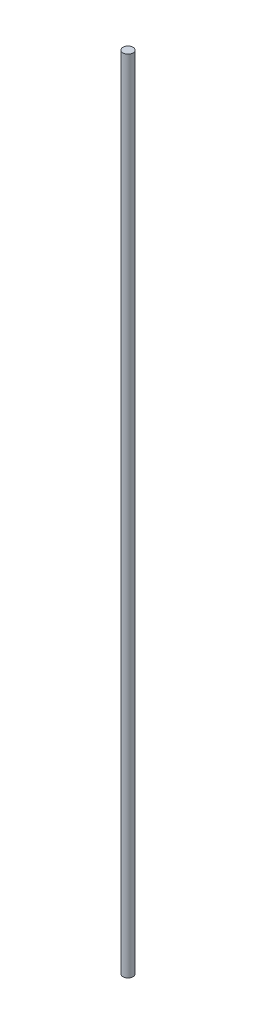
ISO-10303-21;
HEADER;
FILE_DESCRIPTION(('STEP AP214'),'2;1');
FILE_NAME('part.step','',(''),(''),'','','');
FILE_SCHEMA(('AUTOMOTIVE_DESIGN { 1 0 10303 214 1 1 1 1 }'));
ENDSEC;
DATA;
#1=APPLICATION_CONTEXT('core data for automotive mechanical design processes');
#2=APPLICATION_PROTOCOL_DEFINITION('international standard','automotive_design',2000,#1);
#3=PRODUCT_CONTEXT('',#1,'mechanical');
#4=PRODUCT('Part','Part','',(#3));
#5=PRODUCT_RELATED_PRODUCT_CATEGORY('part','',(#4));
#6=PRODUCT_DEFINITION_FORMATION('','',#4);
#7=PRODUCT_DEFINITION_CONTEXT('part definition',#1,'design');
#8=PRODUCT_DEFINITION('design','',#6,#7);
#9=PRODUCT_DEFINITION_SHAPE('','',#8);
#10=(LENGTH_UNIT() NAMED_UNIT(*) SI_UNIT(.MILLI.,.METRE.));
#11=(NAMED_UNIT(*) PLANE_ANGLE_UNIT() SI_UNIT($,.RADIAN.));
#12=(NAMED_UNIT(*) SI_UNIT($,.STERADIAN.) SOLID_ANGLE_UNIT());
#13=UNCERTAINTY_MEASURE_WITH_UNIT(LENGTH_MEASURE(1.E-05),#10,'distance_accuracy_value','');
#14=(GEOMETRIC_REPRESENTATION_CONTEXT(3) GLOBAL_UNCERTAINTY_ASSIGNED_CONTEXT((#13)) GLOBAL_UNIT_ASSIGNED_CONTEXT((#10,
#11,#12)) REPRESENTATION_CONTEXT('',''));
#15=CARTESIAN_POINT('',(0.,0.,0.));
#16=DIRECTION('',(0.,0.,1.));
#17=DIRECTION('',(1.,0.,0.));
#18=AXIS2_PLACEMENT_3D('',#15,#16,#17);
#19=CARTESIAN_POINT('',(0.,400.,0.));
#20=DIRECTION('',(0.,-1.,0.));
#21=DIRECTION('',(0.,0.,-1.));
#22=AXIS2_PLACEMENT_3D('',#19,#20,#21);
#23=CYLINDRICAL_SURFACE('',#22,2.5);
#24=CARTESIAN_POINT('',(0.,400.,0.));
#25=DIRECTION('',(0.,1.,0.));
#26=DIRECTION('',(0.,0.,1.));
#27=AXIS2_PLACEMENT_3D('',#24,#25,#26);
#28=CIRCLE('',#27,2.5);
#29=CARTESIAN_POINT('',(0.,400.,2.5));
#30=VERTEX_POINT('',#29);
#31=EDGE_CURVE('E10',#30,#30,#28,.T.);
#32=ORIENTED_EDGE('',*,*,#31,.F.);
#33=EDGE_LOOP('',(#32));
#34=FACE_BOUND('',#33,.T.);
#35=CARTESIAN_POINT('',(0.,0.,0.));
#36=DIRECTION('',(0.,1.,0.));
#37=DIRECTION('',(0.,0.,1.));
#38=AXIS2_PLACEMENT_3D('',#35,#36,#37);
#39=CIRCLE('',#38,2.5);
#40=CARTESIAN_POINT('',(0.,0.,2.5));
#41=VERTEX_POINT('',#40);
#42=EDGE_CURVE('E44',#41,#41,#39,.T.);
#43=ORIENTED_EDGE('',*,*,#42,.T.);
#44=EDGE_LOOP('',(#43));
#45=FACE_BOUND('',#44,.T.);
#46=ADVANCED_FACE('F41',(#34,#45),#23,.T.);
#47=CARTESIAN_POINT('',(0.,400.,0.));
#48=DIRECTION('',(0.,1.,0.));
#49=DIRECTION('',(0.,0.,1.));
#50=AXIS2_PLACEMENT_3D('',#47,#48,#49);
#51=PLANE('',#50);
#52=ORIENTED_EDGE('',*,*,#31,.T.);
#53=EDGE_LOOP('',(#52));
#54=FACE_BOUND('',#53,.T.);
#55=ADVANCED_FACE('F58',(#54),#51,.T.);
#56=CARTESIAN_POINT('',(0.,0.,0.));
#57=DIRECTION('',(0.,1.,0.));
#58=DIRECTION('',(0.,0.,1.));
#59=AXIS2_PLACEMENT_3D('',#56,#57,#58);
#60=PLANE('',#59);
#61=ORIENTED_EDGE('',*,*,#42,.F.);
#62=EDGE_LOOP('',(#61));
#63=FACE_BOUND('',#62,.T.);
#64=ADVANCED_FACE('F56',(#63),#60,.F.);
#65=CLOSED_SHELL('',(#46,#55,#64));
#66=MANIFOLD_SOLID_BREP('B2',#65);
#67=ADVANCED_BREP_SHAPE_REPRESENTATION('',(#18,#66),#14);
#68=SHAPE_DEFINITION_REPRESENTATION(#9,#67);
ENDSEC;
END-ISO-10303-21;
